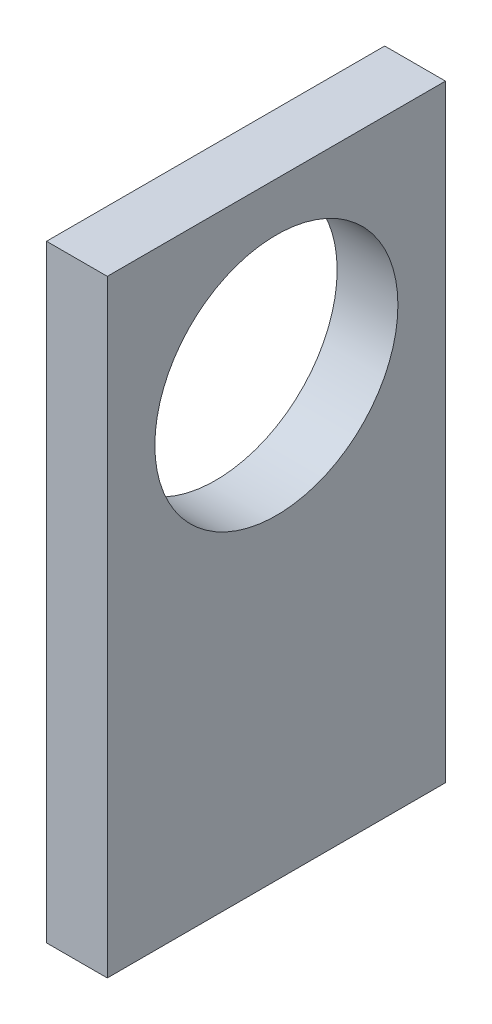
ISO-10303-21;
HEADER;
FILE_DESCRIPTION(('STEP AP214'),'2;1');
FILE_NAME('part.step','',(''),(''),'','','');
FILE_SCHEMA(('AUTOMOTIVE_DESIGN { 1 0 10303 214 1 1 1 1 }'));
ENDSEC;
DATA;
#1=APPLICATION_CONTEXT('core data for automotive mechanical design processes');
#2=APPLICATION_PROTOCOL_DEFINITION('international standard','automotive_design',2000,#1);
#3=PRODUCT_CONTEXT('',#1,'mechanical');
#4=PRODUCT('Part','Part','',(#3));
#5=PRODUCT_RELATED_PRODUCT_CATEGORY('part','',(#4));
#6=PRODUCT_DEFINITION_FORMATION('','',#4);
#7=PRODUCT_DEFINITION_CONTEXT('part definition',#1,'design');
#8=PRODUCT_DEFINITION('design','',#6,#7);
#9=PRODUCT_DEFINITION_SHAPE('','',#8);
#10=(LENGTH_UNIT() NAMED_UNIT(*) SI_UNIT(.MILLI.,.METRE.));
#11=(NAMED_UNIT(*) PLANE_ANGLE_UNIT() SI_UNIT($,.RADIAN.));
#12=(NAMED_UNIT(*) SI_UNIT($,.STERADIAN.) SOLID_ANGLE_UNIT());
#13=UNCERTAINTY_MEASURE_WITH_UNIT(LENGTH_MEASURE(1.E-05),#10,'distance_accuracy_value','');
#14=(GEOMETRIC_REPRESENTATION_CONTEXT(3) GLOBAL_UNCERTAINTY_ASSIGNED_CONTEXT((#13)) GLOBAL_UNIT_ASSIGNED_CONTEXT((#10,
#11,#12)) REPRESENTATION_CONTEXT('',''));
#15=CARTESIAN_POINT('',(0.,0.,0.));
#16=DIRECTION('',(0.,0.,1.));
#17=DIRECTION('',(1.,0.,0.));
#18=AXIS2_PLACEMENT_3D('',#15,#16,#17);
#19=CARTESIAN_POINT('',(6.35,0.,0.));
#20=DIRECTION('',(1.,0.,0.));
#21=DIRECTION('',(0.,0.,-1.));
#22=AXIS2_PLACEMENT_3D('',#19,#20,#21);
#23=PLANE('',#22);
#24=DIRECTION('',(0.,-1.,0.));
#25=VECTOR('',#24,1.);
#26=CARTESIAN_POINT('',(6.35,17.78,17.6698037589727));
#27=LINE('',#26,#25);
#28=CARTESIAN_POINT('',(6.35,17.78,17.6698037589727));
#29=VERTEX_POINT('',#28);
#30=CARTESIAN_POINT('',(6.35,-45.72,17.6698037589727));
#31=VERTEX_POINT('',#30);
#32=EDGE_CURVE('E92',#29,#31,#27,.T.);
#33=ORIENTED_EDGE('',*,*,#32,.T.);
#34=DIRECTION('',(0.,0.,-1.));
#35=VECTOR('',#34,1.);
#36=CARTESIAN_POINT('',(6.35,-45.72,17.6698037589727));
#37=LINE('',#36,#35);
#38=CARTESIAN_POINT('',(6.35,-45.72,-17.6698037589728));
#39=VERTEX_POINT('',#38);
#40=EDGE_CURVE('E87',#31,#39,#37,.T.);
#41=ORIENTED_EDGE('',*,*,#40,.T.);
#42=DIRECTION('',(0.,1.,0.));
#43=VECTOR('',#42,1.);
#44=CARTESIAN_POINT('',(6.35,17.78,-17.6698037589727));
#45=LINE('',#44,#43);
#46=CARTESIAN_POINT('',(6.35,17.78,-17.6698037589727));
#47=VERTEX_POINT('',#46);
#48=EDGE_CURVE('E90',#39,#47,#45,.T.);
#49=ORIENTED_EDGE('',*,*,#48,.T.);
#50=DIRECTION('',(0.,0.,1.));
#51=VECTOR('',#50,1.);
#52=CARTESIAN_POINT('',(6.35,17.78,17.6698037589727));
#53=LINE('',#52,#51);
#54=EDGE_CURVE('E57',#47,#29,#53,.T.);
#55=ORIENTED_EDGE('',*,*,#54,.T.);
#56=EDGE_LOOP('',(#33,#41,#49,#55));
#57=FACE_BOUND('',#56,.T.);
#58=CARTESIAN_POINT('',(6.35,0.,0.));
#59=DIRECTION('',(1.,0.,0.));
#60=DIRECTION('',(0.,0.,-1.));
#61=AXIS2_PLACEMENT_3D('',#58,#59,#60);
#62=CIRCLE('',#61,12.7);
#63=CARTESIAN_POINT('',(6.35,0.,-12.7));
#64=VERTEX_POINT('',#63);
#65=EDGE_CURVE('E112',#64,#64,#62,.T.);
#66=ORIENTED_EDGE('',*,*,#65,.F.);
#67=EDGE_LOOP('',(#66));
#68=FACE_BOUND('',#67,.T.);
#69=ADVANCED_FACE('F39',(#57,#68),#23,.T.);
#70=CARTESIAN_POINT('',(0.,0.,0.));
#71=DIRECTION('',(1.,0.,0.));
#72=DIRECTION('',(0.,0.,-1.));
#73=AXIS2_PLACEMENT_3D('',#70,#71,#72);
#74=PLANE('',#73);
#75=DIRECTION('',(0.,-1.,0.));
#76=VECTOR('',#75,1.);
#77=CARTESIAN_POINT('',(0.,17.78,17.6698037589727));
#78=LINE('',#77,#76);
#79=CARTESIAN_POINT('',(0.,17.78,17.6698037589727));
#80=VERTEX_POINT('',#79);
#81=CARTESIAN_POINT('',(0.,-45.72,17.6698037589727));
#82=VERTEX_POINT('',#81);
#83=EDGE_CURVE('E108',#80,#82,#78,.T.);
#84=ORIENTED_EDGE('',*,*,#83,.F.);
#85=DIRECTION('',(0.,0.,1.));
#86=VECTOR('',#85,1.);
#87=CARTESIAN_POINT('',(0.,17.78,17.6698037589727));
#88=LINE('',#87,#86);
#89=CARTESIAN_POINT('',(0.,17.78,-17.6698037589727));
#90=VERTEX_POINT('',#89);
#91=EDGE_CURVE('E80',#90,#80,#88,.T.);
#92=ORIENTED_EDGE('',*,*,#91,.F.);
#93=DIRECTION('',(0.,1.,0.));
#94=VECTOR('',#93,1.);
#95=CARTESIAN_POINT('',(0.,17.78,-17.6698037589727));
#96=LINE('',#95,#94);
#97=CARTESIAN_POINT('',(0.,-45.72,-17.6698037589728));
#98=VERTEX_POINT('',#97);
#99=EDGE_CURVE('E74',#98,#90,#96,.T.);
#100=ORIENTED_EDGE('',*,*,#99,.F.);
#101=DIRECTION('',(0.,0.,-1.));
#102=VECTOR('',#101,1.);
#103=CARTESIAN_POINT('',(0.,-45.72,17.6698037589727));
#104=LINE('',#103,#102);
#105=EDGE_CURVE('E97',#82,#98,#104,.T.);
#106=ORIENTED_EDGE('',*,*,#105,.F.);
#107=EDGE_LOOP('',(#84,#92,#100,#106));
#108=FACE_BOUND('',#107,.T.);
#109=CARTESIAN_POINT('',(0.,0.,0.));
#110=DIRECTION('',(1.,0.,0.));
#111=DIRECTION('',(0.,0.,-1.));
#112=AXIS2_PLACEMENT_3D('',#109,#110,#111);
#113=CIRCLE('',#112,12.7);
#114=CARTESIAN_POINT('',(0.,0.,-12.7));
#115=VERTEX_POINT('',#114);
#116=EDGE_CURVE('E130',#115,#115,#113,.T.);
#117=ORIENTED_EDGE('',*,*,#116,.T.);
#118=EDGE_LOOP('',(#117));
#119=FACE_BOUND('',#118,.T.);
#120=ADVANCED_FACE('F125',(#108,#119),#74,.F.);
#121=CARTESIAN_POINT('',(6.35,17.78,17.6698037589727));
#122=DIRECTION('',(0.,0.,-1.));
#123=DIRECTION('',(0.,1.,0.));
#124=AXIS2_PLACEMENT_3D('',#121,#122,#123);
#125=PLANE('',#124);
#126=ORIENTED_EDGE('',*,*,#83,.T.);
#127=DIRECTION('',(-1.,0.,0.));
#128=VECTOR('',#127,1.);
#129=CARTESIAN_POINT('',(6.35,-45.72,17.6698037589727));
#130=LINE('',#129,#128);
#131=EDGE_CURVE('E11',#31,#82,#130,.T.);
#132=ORIENTED_EDGE('',*,*,#131,.F.);
#133=ORIENTED_EDGE('',*,*,#32,.F.);
#134=DIRECTION('',(-1.,0.,0.));
#135=VECTOR('',#134,1.);
#136=CARTESIAN_POINT('',(6.35,17.78,17.6698037589727));
#137=LINE('',#136,#135);
#138=EDGE_CURVE('E104',#29,#80,#137,.T.);
#139=ORIENTED_EDGE('',*,*,#138,.T.);
#140=EDGE_LOOP('',(#126,#132,#133,#139));
#141=FACE_BOUND('',#140,.T.);
#142=ADVANCED_FACE('F41',(#141),#125,.F.);
#143=CARTESIAN_POINT('',(6.35,-45.72,17.6698037589727));
#144=DIRECTION('',(0.,1.,0.));
#145=DIRECTION('',(0.,0.,1.));
#146=AXIS2_PLACEMENT_3D('',#143,#144,#145);
#147=PLANE('',#146);
#148=ORIENTED_EDGE('',*,*,#105,.T.);
#149=DIRECTION('',(-1.,0.,0.));
#150=VECTOR('',#149,1.);
#151=CARTESIAN_POINT('',(6.35,-45.72,-17.6698037589728));
#152=LINE('',#151,#150);
#153=EDGE_CURVE('E49',#39,#98,#152,.T.);
#154=ORIENTED_EDGE('',*,*,#153,.F.);
#155=ORIENTED_EDGE('',*,*,#40,.F.);
#156=ORIENTED_EDGE('',*,*,#131,.T.);
#157=EDGE_LOOP('',(#148,#154,#155,#156));
#158=FACE_BOUND('',#157,.T.);
#159=ADVANCED_FACE('F96',(#158),#147,.F.);
#160=CARTESIAN_POINT('',(6.35,17.78,-17.6698037589727));
#161=DIRECTION('',(0.,0.,1.));
#162=DIRECTION('',(0.,-1.,0.));
#163=AXIS2_PLACEMENT_3D('',#160,#161,#162);
#164=PLANE('',#163);
#165=ORIENTED_EDGE('',*,*,#99,.T.);
#166=DIRECTION('',(-1.,0.,0.));
#167=VECTOR('',#166,1.);
#168=CARTESIAN_POINT('',(6.35,17.78,-17.6698037589727));
#169=LINE('',#168,#167);
#170=EDGE_CURVE('E99',#47,#90,#169,.T.);
#171=ORIENTED_EDGE('',*,*,#170,.F.);
#172=ORIENTED_EDGE('',*,*,#48,.F.);
#173=ORIENTED_EDGE('',*,*,#153,.T.);
#174=EDGE_LOOP('',(#165,#171,#172,#173));
#175=FACE_BOUND('',#174,.T.);
#176=ADVANCED_FACE('F100',(#175),#164,.F.);
#177=CARTESIAN_POINT('',(6.35,17.78,17.6698037589727));
#178=DIRECTION('',(0.,-1.,0.));
#179=DIRECTION('',(0.,0.,-1.));
#180=AXIS2_PLACEMENT_3D('',#177,#178,#179);
#181=PLANE('',#180);
#182=ORIENTED_EDGE('',*,*,#91,.T.);
#183=ORIENTED_EDGE('',*,*,#138,.F.);
#184=ORIENTED_EDGE('',*,*,#54,.F.);
#185=ORIENTED_EDGE('',*,*,#170,.T.);
#186=EDGE_LOOP('',(#182,#183,#184,#185));
#187=FACE_BOUND('',#186,.T.);
#188=ADVANCED_FACE('F122',(#187),#181,.F.);
#189=CARTESIAN_POINT('',(6.35,0.,0.));
#190=DIRECTION('',(-1.,0.,0.));
#191=DIRECTION('',(0.,0.,1.));
#192=AXIS2_PLACEMENT_3D('',#189,#190,#191);
#193=CYLINDRICAL_SURFACE('',#192,12.7);
#194=ORIENTED_EDGE('',*,*,#65,.T.);
#195=EDGE_LOOP('',(#194));
#196=FACE_BOUND('',#195,.T.);
#197=ORIENTED_EDGE('',*,*,#116,.F.);
#198=EDGE_LOOP('',(#197));
#199=FACE_BOUND('',#198,.T.);
#200=ADVANCED_FACE('F138',(#196,#199),#193,.F.);
#201=CLOSED_SHELL('',(#69,#120,#142,#159,#176,#188,#200));
#202=MANIFOLD_SOLID_BREP('B2',#201);
#203=ADVANCED_BREP_SHAPE_REPRESENTATION('',(#18,#202),#14);
#204=SHAPE_DEFINITION_REPRESENTATION(#9,#203);
ENDSEC;
END-ISO-10303-21;
